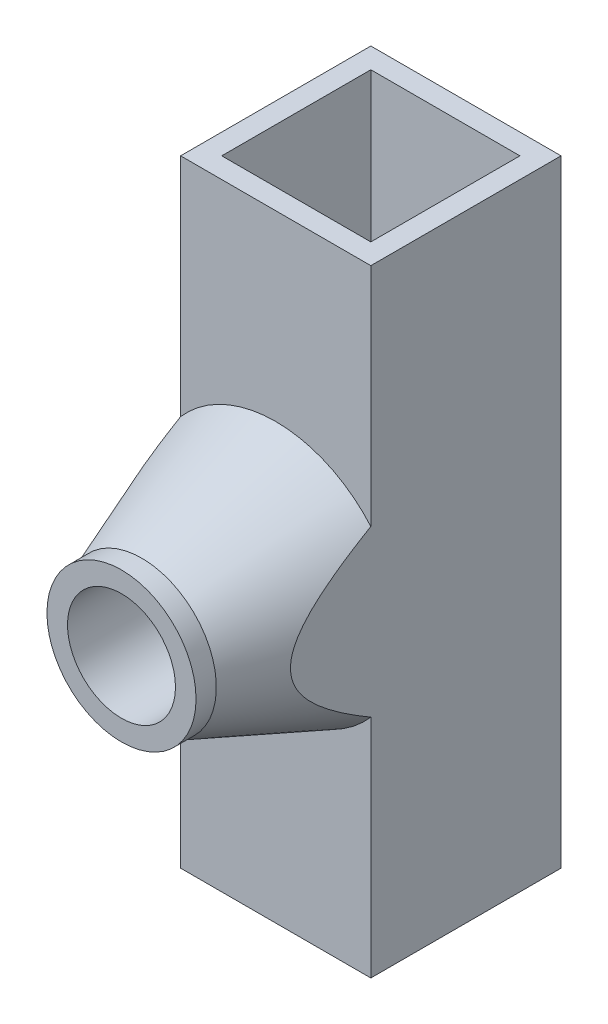
ISO-10303-21;
HEADER;
FILE_DESCRIPTION(('STEP AP214'),'2;1');
FILE_NAME('part.step','',(''),(''),'','','');
FILE_SCHEMA(('AUTOMOTIVE_DESIGN { 1 0 10303 214 1 1 1 1 }'));
ENDSEC;
DATA;
#1=APPLICATION_CONTEXT('core data for automotive mechanical design processes');
#2=APPLICATION_PROTOCOL_DEFINITION('international standard','automotive_design',2000,#1);
#3=PRODUCT_CONTEXT('',#1,'mechanical');
#4=PRODUCT('Part','Part','',(#3));
#5=PRODUCT_RELATED_PRODUCT_CATEGORY('part','',(#4));
#6=PRODUCT_DEFINITION_FORMATION('','',#4);
#7=PRODUCT_DEFINITION_CONTEXT('part definition',#1,'design');
#8=PRODUCT_DEFINITION('design','',#6,#7);
#9=PRODUCT_DEFINITION_SHAPE('','',#8);
#10=(LENGTH_UNIT() NAMED_UNIT(*) SI_UNIT(.MILLI.,.METRE.));
#11=(NAMED_UNIT(*) PLANE_ANGLE_UNIT() SI_UNIT($,.RADIAN.));
#12=(NAMED_UNIT(*) SI_UNIT($,.STERADIAN.) SOLID_ANGLE_UNIT());
#13=UNCERTAINTY_MEASURE_WITH_UNIT(LENGTH_MEASURE(1.E-05),#10,'distance_accuracy_value','');
#14=(GEOMETRIC_REPRESENTATION_CONTEXT(3) GLOBAL_UNCERTAINTY_ASSIGNED_CONTEXT((#13)) GLOBAL_UNIT_ASSIGNED_CONTEXT((#10,
#11,#12)) REPRESENTATION_CONTEXT('',''));
#15=CARTESIAN_POINT('',(0.,0.,0.));
#16=DIRECTION('',(0.,0.,1.));
#17=DIRECTION('',(1.,0.,0.));
#18=AXIS2_PLACEMENT_3D('',#15,#16,#17);
#19=CARTESIAN_POINT('',(-9.25,60.,9.25));
#20=DIRECTION('',(0.,0.,-1.));
#21=DIRECTION('',(-1.,0.,0.));
#22=AXIS2_PLACEMENT_3D('',#19,#20,#21);
#23=PLANE('',#22);
#24=DIRECTION('',(0.,-1.,0.));
#25=VECTOR('',#24,1.);
#26=CARTESIAN_POINT('',(9.25,60.,9.25));
#27=LINE('',#26,#25);
#28=CARTESIAN_POINT('',(9.25,21.9688107978954,9.25));
#29=VERTEX_POINT('',#28);
#30=CARTESIAN_POINT('',(9.25,0.,9.25));
#31=VERTEX_POINT('',#30);
#32=EDGE_CURVE('E187',#29,#31,#27,.T.);
#33=ORIENTED_EDGE('',*,*,#32,.F.);
#34=CARTESIAN_POINT('',(0.,30.,9.25));
#35=DIRECTION('',(0.,0.,-1.));
#36=DIRECTION('',(-1.,0.,0.));
#37=AXIS2_PLACEMENT_3D('',#34,#35,#36);
#38=CIRCLE('',#37,12.2500000000001);
#39=CARTESIAN_POINT('',(-9.24999999999999,21.9688107978954,9.25));
#40=VERTEX_POINT('',#39);
#41=EDGE_CURVE('E199',#29,#40,#38,.T.);
#42=ORIENTED_EDGE('',*,*,#41,.T.);
#43=DIRECTION('',(0.,-1.,0.));
#44=VECTOR('',#43,1.);
#45=CARTESIAN_POINT('',(-9.25,60.,9.25));
#46=LINE('',#45,#44);
#47=CARTESIAN_POINT('',(-9.25,0.,9.25));
#48=VERTEX_POINT('',#47);
#49=EDGE_CURVE('E191',#40,#48,#46,.T.);
#50=ORIENTED_EDGE('',*,*,#49,.T.);
#51=DIRECTION('',(1.,0.,0.));
#52=VECTOR('',#51,1.);
#53=CARTESIAN_POINT('',(-9.25,0.,9.25));
#54=LINE('',#53,#52);
#55=EDGE_CURVE('E176',#48,#31,#54,.T.);
#56=ORIENTED_EDGE('',*,*,#55,.T.);
#57=EDGE_LOOP('',(#33,#42,#50,#56));
#58=FACE_BOUND('',#57,.T.);
#59=ADVANCED_FACE('F35',(#58),#23,.F.);
#60=CARTESIAN_POINT('',(0.,60.,0.));
#61=DIRECTION('',(0.,-1.,0.));
#62=DIRECTION('',(0.,0.,-1.));
#63=AXIS2_PLACEMENT_3D('',#60,#61,#62);
#64=PLANE('',#63);
#65=DIRECTION('',(0.,0.,1.));
#66=VECTOR('',#65,1.);
#67=CARTESIAN_POINT('',(-9.25,60.,9.25));
#68=LINE('',#67,#66);
#69=CARTESIAN_POINT('',(-9.25,60.,-9.25));
#70=VERTEX_POINT('',#69);
#71=CARTESIAN_POINT('',(-9.25,60.,9.25));
#72=VERTEX_POINT('',#71);
#73=EDGE_CURVE('E163',#70,#72,#68,.T.);
#74=ORIENTED_EDGE('',*,*,#73,.T.);
#75=DIRECTION('',(1.,0.,0.));
#76=VECTOR('',#75,1.);
#77=CARTESIAN_POINT('',(-9.25,60.,9.25));
#78=LINE('',#77,#76);
#79=CARTESIAN_POINT('',(9.25,60.,9.25));
#80=VERTEX_POINT('',#79);
#81=EDGE_CURVE('E166',#72,#80,#78,.T.);
#82=ORIENTED_EDGE('',*,*,#81,.T.);
#83=DIRECTION('',(0.,0.,-1.));
#84=VECTOR('',#83,1.);
#85=CARTESIAN_POINT('',(9.25,60.,9.25));
#86=LINE('',#85,#84);
#87=CARTESIAN_POINT('',(9.25,60.,-9.25));
#88=VERTEX_POINT('',#87);
#89=EDGE_CURVE('E169',#80,#88,#86,.T.);
#90=ORIENTED_EDGE('',*,*,#89,.T.);
#91=DIRECTION('',(-1.,0.,0.));
#92=VECTOR('',#91,1.);
#93=CARTESIAN_POINT('',(-9.25,60.,-9.25));
#94=LINE('',#93,#92);
#95=EDGE_CURVE('E171',#88,#70,#94,.T.);
#96=ORIENTED_EDGE('',*,*,#95,.T.);
#97=EDGE_LOOP('',(#74,#82,#90,#96));
#98=FACE_BOUND('',#97,.T.);
#99=DIRECTION('',(0.,0.,-1.));
#100=VECTOR('',#99,1.);
#101=CARTESIAN_POINT('',(7.25,60.,7.25));
#102=LINE('',#101,#100);
#103=CARTESIAN_POINT('',(7.25,60.,7.25));
#104=VERTEX_POINT('',#103);
#105=CARTESIAN_POINT('',(7.25,60.,-7.25));
#106=VERTEX_POINT('',#105);
#107=EDGE_CURVE('E119',#104,#106,#102,.T.);
#108=ORIENTED_EDGE('',*,*,#107,.F.);
#109=DIRECTION('',(1.,0.,0.));
#110=VECTOR('',#109,1.);
#111=CARTESIAN_POINT('',(-7.25,60.,7.25));
#112=LINE('',#111,#110);
#113=CARTESIAN_POINT('',(-7.25,60.,7.25));
#114=VERTEX_POINT('',#113);
#115=EDGE_CURVE('E145',#114,#104,#112,.T.);
#116=ORIENTED_EDGE('',*,*,#115,.F.);
#117=DIRECTION('',(0.,0.,1.));
#118=VECTOR('',#117,1.);
#119=CARTESIAN_POINT('',(-7.25,60.,7.25));
#120=LINE('',#119,#118);
#121=CARTESIAN_POINT('',(-7.25,60.,-7.25));
#122=VERTEX_POINT('',#121);
#123=EDGE_CURVE('E143',#122,#114,#120,.T.);
#124=ORIENTED_EDGE('',*,*,#123,.F.);
#125=DIRECTION('',(-1.,0.,0.));
#126=VECTOR('',#125,1.);
#127=CARTESIAN_POINT('',(-7.25,60.,-7.25));
#128=LINE('',#127,#126);
#129=EDGE_CURVE('E129',#106,#122,#128,.T.);
#130=ORIENTED_EDGE('',*,*,#129,.F.);
#131=EDGE_LOOP('',(#108,#116,#124,#130));
#132=FACE_BOUND('',#131,.T.);
#133=ADVANCED_FACE('F141',(#98,#132),#64,.F.);
#134=CARTESIAN_POINT('',(0.,0.,0.));
#135=DIRECTION('',(0.,-1.,0.));
#136=DIRECTION('',(0.,0.,-1.));
#137=AXIS2_PLACEMENT_3D('',#134,#135,#136);
#138=PLANE('',#137);
#139=DIRECTION('',(0.,0.,1.));
#140=VECTOR('',#139,1.);
#141=CARTESIAN_POINT('',(-9.25,0.,9.25));
#142=LINE('',#141,#140);
#143=CARTESIAN_POINT('',(-9.25,0.,-9.25));
#144=VERTEX_POINT('',#143);
#145=EDGE_CURVE('E137',#144,#48,#142,.T.);
#146=ORIENTED_EDGE('',*,*,#145,.F.);
#147=DIRECTION('',(-1.,0.,0.));
#148=VECTOR('',#147,1.);
#149=CARTESIAN_POINT('',(-9.25,0.,-9.25));
#150=LINE('',#149,#148);
#151=CARTESIAN_POINT('',(9.25,0.,-9.25));
#152=VERTEX_POINT('',#151);
#153=EDGE_CURVE('E167',#152,#144,#150,.T.);
#154=ORIENTED_EDGE('',*,*,#153,.F.);
#155=DIRECTION('',(0.,0.,-1.));
#156=VECTOR('',#155,1.);
#157=CARTESIAN_POINT('',(9.25,0.,9.25));
#158=LINE('',#157,#156);
#159=EDGE_CURVE('E179',#31,#152,#158,.T.);
#160=ORIENTED_EDGE('',*,*,#159,.F.);
#161=ORIENTED_EDGE('',*,*,#55,.F.);
#162=EDGE_LOOP('',(#146,#154,#160,#161));
#163=FACE_BOUND('',#162,.T.);
#164=DIRECTION('',(1.,0.,0.));
#165=VECTOR('',#164,1.);
#166=CARTESIAN_POINT('',(-7.25,0.,7.25));
#167=LINE('',#166,#165);
#168=CARTESIAN_POINT('',(-7.25,0.,7.25));
#169=VERTEX_POINT('',#168);
#170=CARTESIAN_POINT('',(7.25,0.,7.25));
#171=VERTEX_POINT('',#170);
#172=EDGE_CURVE('E130',#169,#171,#167,.T.);
#173=ORIENTED_EDGE('',*,*,#172,.T.);
#174=DIRECTION('',(0.,0.,-1.));
#175=VECTOR('',#174,1.);
#176=CARTESIAN_POINT('',(7.25,0.,7.25));
#177=LINE('',#176,#175);
#178=CARTESIAN_POINT('',(7.25,0.,-7.25));
#179=VERTEX_POINT('',#178);
#180=EDGE_CURVE('E150',#171,#179,#177,.T.);
#181=ORIENTED_EDGE('',*,*,#180,.T.);
#182=DIRECTION('',(-1.,0.,0.));
#183=VECTOR('',#182,1.);
#184=CARTESIAN_POINT('',(-7.25,0.,-7.25));
#185=LINE('',#184,#183);
#186=CARTESIAN_POINT('',(-7.25,0.,-7.25));
#187=VERTEX_POINT('',#186);
#188=EDGE_CURVE('E136',#179,#187,#185,.T.);
#189=ORIENTED_EDGE('',*,*,#188,.T.);
#190=DIRECTION('',(0.,0.,1.));
#191=VECTOR('',#190,1.);
#192=CARTESIAN_POINT('',(-7.25,0.,7.25));
#193=LINE('',#192,#191);
#194=EDGE_CURVE('E154',#187,#169,#193,.T.);
#195=ORIENTED_EDGE('',*,*,#194,.T.);
#196=EDGE_LOOP('',(#173,#181,#189,#195));
#197=FACE_BOUND('',#196,.T.);
#198=ADVANCED_FACE('F209',(#163,#197),#138,.T.);
#199=CARTESIAN_POINT('',(-9.25,60.,9.25));
#200=DIRECTION('',(1.,0.,0.));
#201=DIRECTION('',(0.,0.,-1.));
#202=AXIS2_PLACEMENT_3D('',#199,#200,#201);
#203=PLANE('',#202);
#204=ORIENTED_EDGE('',*,*,#145,.T.);
#205=ORIENTED_EDGE('',*,*,#49,.F.);
#206=CARTESIAN_POINT('',(-9.24999999999999,21.9688107978954,9.25));
#207=CARTESIAN_POINT('',(-9.25,22.0998502347088,9.47377236531905));
#208=CARTESIAN_POINT('',(-9.25,22.2322280610886,9.69676945373188));
#209=CARTESIAN_POINT('',(-9.25,22.5000801055316,10.1409312038004));
#210=CARTESIAN_POINT('',(-9.25,22.6355546920192,10.3620956431145));
#211=CARTESIAN_POINT('',(-9.25,22.9105236369142,10.8031144976088));
#212=CARTESIAN_POINT('',(-9.25,23.0500316069383,11.0229604448278));
#213=CARTESIAN_POINT('',(-9.25,23.3330674366534,11.4600420813109));
#214=CARTESIAN_POINT('',(-9.25,23.4765951463395,11.6772778675473));
#215=CARTESIAN_POINT('',(-9.25,23.7791305524686,12.124645363236));
#216=CARTESIAN_POINT('',(-9.25,23.9384960388576,12.3545358930776));
#217=CARTESIAN_POINT('',(-9.25,24.2635238104705,12.8098178890145));
#218=CARTESIAN_POINT('',(-9.25,24.4291857303331,13.0352096150067));
#219=CARTESIAN_POINT('',(-9.25,24.7677449662675,13.4799576836558));
#220=CARTESIAN_POINT('',(-9.25,24.9406304655562,13.6993229798547));
#221=CARTESIAN_POINT('',(-9.25,25.295353162725,14.1306557184592));
#222=CARTESIAN_POINT('',(-9.25,25.4771882820216,14.342624859288));
#223=CARTESIAN_POINT('',(-9.25,25.8490711698124,14.7537844216926));
#224=CARTESIAN_POINT('',(-9.25,26.0389626821234,14.9531150460284));
#225=CARTESIAN_POINT('',(-9.25,26.4318525461622,15.3389561871389));
#226=CARTESIAN_POINT('',(-9.25,26.6348629981991,15.5254545310356));
#227=CARTESIAN_POINT('',(-9.25,27.0530902073979,15.8771041275751));
#228=CARTESIAN_POINT('',(-9.25,27.2680478767356,16.0425587674184));
#229=CARTESIAN_POINT('',(-9.25,27.7153570349319,16.3475041688852));
#230=CARTESIAN_POINT('',(-9.25,27.9476670746894,16.4870541918361));
#231=CARTESIAN_POINT('',(-9.25,28.3921110042399,16.7093747885392));
#232=CARTESIAN_POINT('',(-9.25,28.6013840860517,16.797688060112));
#233=CARTESIAN_POINT('',(-9.25,28.9237595636488,16.9043042800264));
#234=CARTESIAN_POINT('',(-9.25,29.0326342159228,16.9355349108723));
#235=CARTESIAN_POINT('',(-9.25,29.2526630859879,16.9884287559335));
#236=CARTESIAN_POINT('',(-9.25,29.3638161909976,17.0100965293273));
#237=CARTESIAN_POINT('',(-9.25,29.5886771350415,17.0432433557319));
#238=CARTESIAN_POINT('',(-9.25,29.7023990118196,17.0546280112001));
#239=CARTESIAN_POINT('',(-9.25,29.9304120161294,17.0664143853952));
#240=CARTESIAN_POINT('',(-9.25,30.0447031188529,17.0668165786463));
#241=CARTESIAN_POINT('',(-9.25,30.2728279387194,17.0566193968731));
#242=CARTESIAN_POINT('',(-9.25,30.3866614876192,17.0460162911388));
#243=CARTESIAN_POINT('',(-9.25,30.6128826526013,17.0142257244595));
#244=CARTESIAN_POINT('',(-9.25,30.7252694710036,16.9930326611068));
#245=CARTESIAN_POINT('',(-9.25,30.9614715209607,16.9376124680714));
#246=CARTESIAN_POINT('',(-9.25,31.0849841796039,16.9020989542531));
#247=CARTESIAN_POINT('',(-9.25,31.3283452681004,16.8200990034428));
#248=CARTESIAN_POINT('',(-9.25,31.4481910608179,16.7736048696332));
#249=CARTESIAN_POINT('',(-9.25,31.8017663898585,16.6198558987582));
#250=CARTESIAN_POINT('',(-9.25,32.0293539467454,16.4983806163139));
#251=CARTESIAN_POINT('',(-9.25,32.44370867618,16.2434569625604));
#252=CARTESIAN_POINT('',(-9.25,32.6322252155885,16.1127396183795));
#253=CARTESIAN_POINT('',(-9.25,32.9975592734626,15.8356576813769));
#254=CARTESIAN_POINT('',(-9.25,33.1743659276482,15.6892788784021));
#255=CARTESIAN_POINT('',(-9.25,33.5189926282334,15.3838892041528));
#256=CARTESIAN_POINT('',(-9.25,33.6867339902775,15.2247906291425));
#257=CARTESIAN_POINT('',(-9.25,34.0132918744874,14.8978846976661));
#258=CARTESIAN_POINT('',(-9.25,34.1721121924878,14.7300811044825));
#259=CARTESIAN_POINT('',(-9.25,34.5125744353184,14.3542650544142));
#260=CARTESIAN_POINT('',(-9.25,34.6926097742759,14.1448040039739));
#261=CARTESIAN_POINT('',(-9.25,35.0438874542972,13.7185999720595));
#262=CARTESIAN_POINT('',(-9.25,35.2151275998646,13.5018551945108));
#263=CARTESIAN_POINT('',(-9.25,35.550502953978,13.0624304091435));
#264=CARTESIAN_POINT('',(-9.25,35.7146267867817,12.8397417557639));
#265=CARTESIAN_POINT('',(-9.25,36.0366664774369,12.3899162124221));
#266=CARTESIAN_POINT('',(-9.25,36.1945819637713,12.1627790574693));
#267=CARTESIAN_POINT('',(-9.25,36.4983165251387,11.7149640489289));
#268=CARTESIAN_POINT('',(-9.25,36.6443624023799,11.4944395608964));
#269=CARTESIAN_POINT('',(-9.25,36.9322795510408,11.0506735517005));
#270=CARTESIAN_POINT('',(-9.25,37.0741506419109,10.8274319136152));
#271=CARTESIAN_POINT('',(-9.25,37.3537027949911,10.3795646612909));
#272=CARTESIAN_POINT('',(-9.25,37.4913981419048,10.1549479432901));
#273=CARTESIAN_POINT('',(-9.25,37.7635851828794,9.70382036068201));
#274=CARTESIAN_POINT('',(-9.25,37.8980772934758,9.47730974758176));
#275=CARTESIAN_POINT('',(-9.25,38.0311892021047,9.25000000000004));
#276=B_SPLINE_CURVE_WITH_KNOTS('',3,(#206,#207,#208,#209,#210,#211,#212,#213,#214,#215,#216,
#217,#218,#219,#220,#221,#222,#223,#224,#225,#226,#227,#228,#229,#230,#231,#232,#233,#234,#235,
#236,#237,#238,#239,#240,#241,#242,#243,#244,#245,#246,#247,#248,#249,#250,#251,#252,#253,#254,
#255,#256,#257,#258,#259,#260,#261,#262,#263,#264,#265,#266,#267,#268,#269,#270,#271,#272,#273,
#274,#275),.UNSPECIFIED.,.F.,.F.,(4,2,2,2,2,2,2,2,2,2,2,2,2,2,2,2,2,2,2,2,2,2,2,2,2,2,2,2,2,2,2,
2,2,2,4),(0.,0.777957788967081,1.55600861901822,2.33709255410999,3.11814738018199,
3.95723855713903,4.79628111850582,5.63400109662313,6.47152742083613,7.29697539302101,
8.12319589845028,8.93567840396673,9.74627866924139,10.4250832285197,10.764516623085,
11.1037880144456,11.4461431168985,11.7884834270352,12.130939825759,12.4735775863752,
12.8585275452384,13.2437481381477,14.014739517724,14.7020399312754,15.3899693299932,
16.0831372305757,16.7760079239939,17.6043005687233,18.4327989806615,19.2625763221648,
20.0924032434948,20.8858507948706,21.6793326106915,22.4696937006379,23.2599514478745),.UNSPECIFIED.);
#277=CARTESIAN_POINT('',(-9.24999999999999,38.0311892021046,9.25));
#278=VERTEX_POINT('',#277);
#279=EDGE_CURVE('E50',#40,#278,#276,.T.);
#280=ORIENTED_EDGE('',*,*,#279,.T.);
#281=EDGE_CURVE('E192',#72,#278,#46,.T.);
#282=ORIENTED_EDGE('',*,*,#281,.F.);
#283=ORIENTED_EDGE('',*,*,#73,.F.);
#284=DIRECTION('',(0.,-1.,0.));
#285=VECTOR('',#284,1.);
#286=CARTESIAN_POINT('',(-9.25,60.,-9.25));
#287=LINE('',#286,#285);
#288=EDGE_CURVE('E173',#70,#144,#287,.T.);
#289=ORIENTED_EDGE('',*,*,#288,.T.);
#290=EDGE_LOOP('',(#204,#205,#280,#282,#283,#289));
#291=FACE_BOUND('',#290,.T.);
#292=ADVANCED_FACE('F204',(#291),#203,.F.);
#293=ORIENTED_EDGE('',*,*,#281,.T.);
#294=CARTESIAN_POINT('',(0.,30.,9.25));
#295=DIRECTION('',(0.,0.,-1.));
#296=DIRECTION('',(-1.,0.,0.));
#297=AXIS2_PLACEMENT_3D('',#294,#295,#296);
#298=CIRCLE('',#297,12.2500000000001);
#299=CARTESIAN_POINT('',(9.25,38.0311892021046,9.25));
#300=VERTEX_POINT('',#299);
#301=EDGE_CURVE('E197',#278,#300,#298,.T.);
#302=ORIENTED_EDGE('',*,*,#301,.T.);
#303=EDGE_CURVE('E188',#80,#300,#27,.T.);
#304=ORIENTED_EDGE('',*,*,#303,.F.);
#305=ORIENTED_EDGE('',*,*,#81,.F.);
#306=EDGE_LOOP('',(#293,#302,#304,#305));
#307=FACE_BOUND('',#306,.T.);
#308=ADVANCED_FACE('F208',(#307),#23,.F.);
#309=CARTESIAN_POINT('',(9.25,60.,9.25));
#310=DIRECTION('',(-1.,0.,0.));
#311=DIRECTION('',(0.,0.,1.));
#312=AXIS2_PLACEMENT_3D('',#309,#310,#311);
#313=PLANE('',#312);
#314=ORIENTED_EDGE('',*,*,#159,.T.);
#315=DIRECTION('',(0.,-1.,0.));
#316=VECTOR('',#315,1.);
#317=CARTESIAN_POINT('',(9.25,60.,-9.25));
#318=LINE('',#317,#316);
#319=EDGE_CURVE('E184',#88,#152,#318,.T.);
#320=ORIENTED_EDGE('',*,*,#319,.F.);
#321=ORIENTED_EDGE('',*,*,#89,.F.);
#322=ORIENTED_EDGE('',*,*,#303,.T.);
#323=CARTESIAN_POINT('',(9.25,38.0311892021046,9.25));
#324=CARTESIAN_POINT('',(9.25,37.9001497652912,9.47377236531905));
#325=CARTESIAN_POINT('',(9.25,37.7677719389114,9.69676945373189));
#326=CARTESIAN_POINT('',(9.25,37.4999198944684,10.1409312038004));
#327=CARTESIAN_POINT('',(9.25,37.3644453079808,10.3620956431145));
#328=CARTESIAN_POINT('',(9.25,37.0894763630858,10.8031144976088));
#329=CARTESIAN_POINT('',(9.25,36.9499683930617,11.0229604448278));
#330=CARTESIAN_POINT('',(9.25,36.6669325633466,11.4600420813109));
#331=CARTESIAN_POINT('',(9.25,36.5234048536606,11.6772778675473));
#332=CARTESIAN_POINT('',(9.25,36.2208694475314,12.124645363236));
#333=CARTESIAN_POINT('',(9.25,36.0615039611424,12.3545358930776));
#334=CARTESIAN_POINT('',(9.25,35.7364761895295,12.8098178890145));
#335=CARTESIAN_POINT('',(9.25,35.5708142696669,13.0352096150067));
#336=CARTESIAN_POINT('',(9.25,35.2322550337325,13.4799576836558));
#337=CARTESIAN_POINT('',(9.25,35.0593695344438,13.6993229798547));
#338=CARTESIAN_POINT('',(9.25,34.704646837275,14.1306557184592));
#339=CARTESIAN_POINT('',(9.25,34.5228117179784,14.342624859288));
#340=CARTESIAN_POINT('',(9.25,34.1509288301876,14.7537844216926));
#341=CARTESIAN_POINT('',(9.25,33.9610373178766,14.9531150460284));
#342=CARTESIAN_POINT('',(9.25,33.5681474538378,15.3389561871389));
#343=CARTESIAN_POINT('',(9.25,33.3651370018009,15.5254545310356));
#344=CARTESIAN_POINT('',(9.25,32.9469097926021,15.8771041275751));
#345=CARTESIAN_POINT('',(9.25,32.7319521232645,16.0425587674183));
#346=CARTESIAN_POINT('',(9.25,32.2846429650681,16.3475041688851));
#347=CARTESIAN_POINT('',(9.25,32.0523329253106,16.4870541918361));
#348=CARTESIAN_POINT('',(9.25,31.6078889957601,16.7093747885392));
#349=CARTESIAN_POINT('',(9.25,31.3986159139483,16.797688060112));
#350=CARTESIAN_POINT('',(9.25,31.0762404363512,16.9043042800264));
#351=CARTESIAN_POINT('',(9.25,30.9673657840772,16.9355349108723));
#352=CARTESIAN_POINT('',(9.25,30.7473369140122,16.9884287559335));
#353=CARTESIAN_POINT('',(9.25,30.6361838090024,17.0100965293273));
#354=CARTESIAN_POINT('',(9.25,30.4113228649585,17.0432433557319));
#355=CARTESIAN_POINT('',(9.25,30.2976009881805,17.0546280112001));
#356=CARTESIAN_POINT('',(9.25,30.0695879838707,17.0664143853952));
#357=CARTESIAN_POINT('',(9.25,29.9552968811472,17.0668165786463));
#358=CARTESIAN_POINT('',(9.25,29.7271720612806,17.0566193968731));
#359=CARTESIAN_POINT('',(9.25,29.6133385123808,17.0460162911388));
#360=CARTESIAN_POINT('',(9.25,29.3871173473988,17.0142257244595));
#361=CARTESIAN_POINT('',(9.25,29.2747305289964,16.9930326611068));
#362=CARTESIAN_POINT('',(9.25,29.0385284790394,16.9376124680714));
#363=CARTESIAN_POINT('',(9.25,28.9150158203961,16.9020989542531));
#364=CARTESIAN_POINT('',(9.25,28.6716547318996,16.8200990034428));
#365=CARTESIAN_POINT('',(9.25,28.5518089391821,16.7736048696332));
#366=CARTESIAN_POINT('',(9.25,28.1982336101415,16.6198558987582));
#367=CARTESIAN_POINT('',(9.25,27.9706460532546,16.4983806163139));
#368=CARTESIAN_POINT('',(9.25,27.55629132382,16.2434569625604));
#369=CARTESIAN_POINT('',(9.25,27.3677747844116,16.1127396183795));
#370=CARTESIAN_POINT('',(9.25,27.0024407265375,15.835657681377));
#371=CARTESIAN_POINT('',(9.25,26.8256340723519,15.6892788784022));
#372=CARTESIAN_POINT('',(9.25,26.4810073717667,15.3838892041528));
#373=CARTESIAN_POINT('',(9.25,26.3132660097226,15.2247906291425));
#374=CARTESIAN_POINT('',(9.25,25.9867081255127,14.8978846976662));
#375=CARTESIAN_POINT('',(9.25,25.8278878075123,14.7300811044826));
#376=CARTESIAN_POINT('',(9.25,25.4874255646817,14.3542650544143));
#377=CARTESIAN_POINT('',(9.25,25.3073902257242,14.144804003974));
#378=CARTESIAN_POINT('',(9.25,24.9561125457028,13.7185999720596));
#379=CARTESIAN_POINT('',(9.25,24.7848724001354,13.5018551945108));
#380=CARTESIAN_POINT('',(9.25,24.449497046022,13.0624304091436));
#381=CARTESIAN_POINT('',(9.25,24.2853732132184,12.839741755764));
#382=CARTESIAN_POINT('',(9.25,23.9633335225631,12.3899162124221));
#383=CARTESIAN_POINT('',(9.25,23.8054180362287,12.1627790574693));
#384=CARTESIAN_POINT('',(9.25,23.5016834748613,11.714964048929));
#385=CARTESIAN_POINT('',(9.25,23.3556375976201,11.4944395608965));
#386=CARTESIAN_POINT('',(9.25,23.0677204489592,11.0506735517005));
#387=CARTESIAN_POINT('',(9.25,22.9258493580892,10.8274319136152));
#388=CARTESIAN_POINT('',(9.25,22.646297205009,10.3795646612909));
#389=CARTESIAN_POINT('',(9.25,22.5086018580952,10.1549479432901));
#390=CARTESIAN_POINT('',(9.25,22.2364148171206,9.70382036068203));
#391=CARTESIAN_POINT('',(9.25,22.1019227065242,9.47730974758177));
#392=CARTESIAN_POINT('',(9.25,21.9688107978953,9.25000000000004));
#393=B_SPLINE_CURVE_WITH_KNOTS('',3,(#323,#324,#325,#326,#327,#328,#329,#330,#331,#332,#333,
#334,#335,#336,#337,#338,#339,#340,#341,#342,#343,#344,#345,#346,#347,#348,#349,#350,#351,#352,
#353,#354,#355,#356,#357,#358,#359,#360,#361,#362,#363,#364,#365,#366,#367,#368,#369,#370,#371,
#372,#373,#374,#375,#376,#377,#378,#379,#380,#381,#382,#383,#384,#385,#386,#387,#388,#389,#390,
#391,#392),.UNSPECIFIED.,.F.,.F.,(4,2,2,2,2,2,2,2,2,2,2,2,2,2,2,2,2,2,2,2,2,2,2,2,2,2,2,2,2,2,2,
2,2,2,4),(0.,0.777957788967082,1.55600861901822,2.33709255410999,3.11814738018198,
3.95723855713902,4.7962811185058,5.63400109662311,6.4715274208361,7.29697539302097,
8.12319589845023,8.93567840396667,9.74627866924134,10.4250832285196,10.764516623085,
11.1037880144455,11.4461431168984,11.7884834270352,12.130939825759,12.4735775863752,
12.8585275452384,13.2437481381476,14.0147395177239,14.7020399312753,15.3899693299931,
16.0831372305755,16.7760079239938,17.6043005687232,18.4327989806613,19.2625763221646,
20.0924032434947,20.8858507948706,21.6793326106914,22.4696937006379,23.2599514478744),.UNSPECIFIED.);
#394=EDGE_CURVE('E11',#300,#29,#393,.T.);
#395=ORIENTED_EDGE('',*,*,#394,.T.);
#396=ORIENTED_EDGE('',*,*,#32,.T.);
#397=EDGE_LOOP('',(#314,#320,#321,#322,#395,#396));
#398=FACE_BOUND('',#397,.T.);
#399=ADVANCED_FACE('F211',(#398),#313,.F.);
#400=CARTESIAN_POINT('',(-9.25,60.,-9.25));
#401=DIRECTION('',(0.,0.,1.));
#402=DIRECTION('',(1.,0.,0.));
#403=AXIS2_PLACEMENT_3D('',#400,#401,#402);
#404=PLANE('',#403);
#405=ORIENTED_EDGE('',*,*,#153,.T.);
#406=ORIENTED_EDGE('',*,*,#288,.F.);
#407=ORIENTED_EDGE('',*,*,#95,.F.);
#408=ORIENTED_EDGE('',*,*,#319,.T.);
#409=EDGE_LOOP('',(#405,#406,#407,#408));
#410=FACE_BOUND('',#409,.T.);
#411=ADVANCED_FACE('F217',(#410),#404,.F.);
#412=CARTESIAN_POINT('',(7.25,60.,7.25));
#413=DIRECTION('',(-1.,0.,0.));
#414=DIRECTION('',(0.,0.,1.));
#415=AXIS2_PLACEMENT_3D('',#412,#413,#414);
#416=PLANE('',#415);
#417=ORIENTED_EDGE('',*,*,#180,.F.);
#418=DIRECTION('',(0.,-1.,0.));
#419=VECTOR('',#418,1.);
#420=CARTESIAN_POINT('',(7.25,60.,7.25));
#421=LINE('',#420,#419);
#422=EDGE_CURVE('E125',#104,#171,#421,.T.);
#423=ORIENTED_EDGE('',*,*,#422,.F.);
#424=ORIENTED_EDGE('',*,*,#107,.T.);
#425=DIRECTION('',(0.,-1.,0.));
#426=VECTOR('',#425,1.);
#427=CARTESIAN_POINT('',(7.25,60.,-7.25));
#428=LINE('',#427,#426);
#429=EDGE_CURVE('E122',#106,#179,#428,.T.);
#430=ORIENTED_EDGE('',*,*,#429,.T.);
#431=EDGE_LOOP('',(#417,#423,#424,#430));
#432=FACE_BOUND('',#431,.T.);
#433=ADVANCED_FACE('F121',(#432),#416,.T.);
#434=CARTESIAN_POINT('',(-7.25,60.,-7.25));
#435=DIRECTION('',(0.,0.,1.));
#436=DIRECTION('',(1.,0.,0.));
#437=AXIS2_PLACEMENT_3D('',#434,#435,#436);
#438=PLANE('',#437);
#439=ORIENTED_EDGE('',*,*,#188,.F.);
#440=ORIENTED_EDGE('',*,*,#429,.F.);
#441=ORIENTED_EDGE('',*,*,#129,.T.);
#442=DIRECTION('',(0.,-1.,0.));
#443=VECTOR('',#442,1.);
#444=CARTESIAN_POINT('',(-7.25,60.,-7.25));
#445=LINE('',#444,#443);
#446=EDGE_CURVE('E138',#122,#187,#445,.T.);
#447=ORIENTED_EDGE('',*,*,#446,.T.);
#448=EDGE_LOOP('',(#439,#440,#441,#447));
#449=FACE_BOUND('',#448,.T.);
#450=ADVANCED_FACE('F133',(#449),#438,.T.);
#451=CARTESIAN_POINT('',(-7.25,60.,7.25));
#452=DIRECTION('',(1.,0.,0.));
#453=DIRECTION('',(0.,0.,-1.));
#454=AXIS2_PLACEMENT_3D('',#451,#452,#453);
#455=PLANE('',#454);
#456=ORIENTED_EDGE('',*,*,#194,.F.);
#457=ORIENTED_EDGE('',*,*,#446,.F.);
#458=ORIENTED_EDGE('',*,*,#123,.T.);
#459=DIRECTION('',(0.,-1.,0.));
#460=VECTOR('',#459,1.);
#461=CARTESIAN_POINT('',(-7.25,60.,7.25));
#462=LINE('',#461,#460);
#463=EDGE_CURVE('E160',#114,#169,#462,.T.);
#464=ORIENTED_EDGE('',*,*,#463,.T.);
#465=EDGE_LOOP('',(#456,#457,#458,#464));
#466=FACE_BOUND('',#465,.T.);
#467=ADVANCED_FACE('F232',(#466),#455,.T.);
#468=CARTESIAN_POINT('',(-7.25,60.,7.25));
#469=DIRECTION('',(0.,0.,-1.));
#470=DIRECTION('',(-1.,0.,0.));
#471=AXIS2_PLACEMENT_3D('',#468,#469,#470);
#472=PLANE('',#471);
#473=ORIENTED_EDGE('',*,*,#172,.F.);
#474=ORIENTED_EDGE('',*,*,#463,.F.);
#475=ORIENTED_EDGE('',*,*,#115,.T.);
#476=ORIENTED_EDGE('',*,*,#422,.T.);
#477=EDGE_LOOP('',(#473,#474,#475,#476));
#478=FACE_BOUND('',#477,.T.);
#479=ADVANCED_FACE('F235',(#478),#472,.T.);
#480=CARTESIAN_POINT('',(0.,30.,24.25));
#481=DIRECTION('',(0.,0.,1.));
#482=DIRECTION('',(1.,0.,0.));
#483=AXIS2_PLACEMENT_3D('',#480,#481,#482);
#484=PLANE('',#483);
#485=CARTESIAN_POINT('',(0.,30.,24.25));
#486=DIRECTION('',(0.,0.,1.));
#487=DIRECTION('',(1.,0.,0.));
#488=AXIS2_PLACEMENT_3D('',#485,#486,#487);
#489=CIRCLE('',#488,7.25);
#490=CARTESIAN_POINT('',(7.25,30.,24.25));
#491=VERTEX_POINT('',#490);
#492=EDGE_CURVE('E152',#491,#491,#489,.T.);
#493=ORIENTED_EDGE('',*,*,#492,.T.);
#494=EDGE_LOOP('',(#493));
#495=FACE_BOUND('',#494,.T.);
#496=CARTESIAN_POINT('',(0.,30.,24.25));
#497=DIRECTION('',(0.,0.,1.));
#498=DIRECTION('',(1.,0.,0.));
#499=AXIS2_PLACEMENT_3D('',#496,#497,#498);
#500=CIRCLE('',#499,5.25);
#501=CARTESIAN_POINT('',(5.25,30.,24.25));
#502=VERTEX_POINT('',#501);
#503=EDGE_CURVE('E282',#502,#502,#500,.T.);
#504=ORIENTED_EDGE('',*,*,#503,.F.);
#505=EDGE_LOOP('',(#504));
#506=FACE_BOUND('',#505,.T.);
#507=ADVANCED_FACE('F239',(#495,#506),#484,.T.);
#508=CARTESIAN_POINT('',(0.,30.,24.25));
#509=DIRECTION('',(0.,0.,-1.));
#510=DIRECTION('',(-1.,0.,0.));
#511=AXIS2_PLACEMENT_3D('',#508,#509,#510);
#512=CYLINDRICAL_SURFACE('',#511,7.25);
#513=CARTESIAN_POINT('',(0.,30.,22.2754453234694));
#514=DIRECTION('',(0.,0.,-1.));
#515=DIRECTION('',(-1.,0.,0.));
#516=AXIS2_PLACEMENT_3D('',#513,#514,#515);
#517=CIRCLE('',#516,7.25);
#518=CARTESIAN_POINT('',(-7.25,30.,22.2754453234694));
#519=VERTEX_POINT('',#518);
#520=EDGE_CURVE('E194',#519,#519,#517,.F.);
#521=ORIENTED_EDGE('',*,*,#520,.T.);
#522=EDGE_LOOP('',(#521));
#523=FACE_BOUND('',#522,.T.);
#524=ORIENTED_EDGE('',*,*,#492,.F.);
#525=EDGE_LOOP('',(#524));
#526=FACE_BOUND('',#525,.T.);
#527=ADVANCED_FACE('F241',(#523,#526),#512,.T.);
#528=CARTESIAN_POINT('',(0.,30.,24.25));
#529=DIRECTION('',(0.,0.,-1.));
#530=DIRECTION('',(-1.,0.,0.));
#531=AXIS2_PLACEMENT_3D('',#528,#529,#530);
#532=CYLINDRICAL_SURFACE('',#531,5.25);
#533=ORIENTED_EDGE('',*,*,#503,.T.);
#534=EDGE_LOOP('',(#533));
#535=FACE_BOUND('',#534,.T.);
#536=CARTESIAN_POINT('',(0.,30.,9.25));
#537=DIRECTION('',(0.,0.,1.));
#538=DIRECTION('',(1.,0.,0.));
#539=AXIS2_PLACEMENT_3D('',#536,#537,#538);
#540=CIRCLE('',#539,5.25);
#541=CARTESIAN_POINT('',(5.25,30.,9.25));
#542=VERTEX_POINT('',#541);
#543=EDGE_CURVE('E283',#542,#542,#540,.T.);
#544=ORIENTED_EDGE('',*,*,#543,.F.);
#545=EDGE_LOOP('',(#544));
#546=FACE_BOUND('',#545,.T.);
#547=ADVANCED_FACE('F244',(#535,#546),#532,.F.);
#548=ORIENTED_EDGE('',*,*,#543,.T.);
#549=EDGE_LOOP('',(#548));
#550=FACE_BOUND('',#549,.T.);
#551=ADVANCED_FACE('F213',(#550),#23,.F.);
#552=CARTESIAN_POINT('',(0.,30.,22.2754453234694));
#553=DIRECTION('',(0.,0.,-1.));
#554=DIRECTION('',(-1.,0.,0.));
#555=AXIS2_PLACEMENT_3D('',#552,#553,#554);
#556=CONICAL_SURFACE('',#555,7.25,0.366519142918806);
#557=ORIENTED_EDGE('',*,*,#279,.F.);
#558=ORIENTED_EDGE('',*,*,#41,.F.);
#559=ORIENTED_EDGE('',*,*,#394,.F.);
#560=ORIENTED_EDGE('',*,*,#301,.F.);
#561=EDGE_LOOP('',(#557,#558,#559,#560));
#562=FACE_BOUND('',#561,.T.);
#563=ORIENTED_EDGE('',*,*,#520,.F.);
#564=EDGE_LOOP('',(#563));
#565=FACE_BOUND('',#564,.T.);
#566=ADVANCED_FACE('F38',(#562,#565),#556,.T.);
#567=CLOSED_SHELL('',(#59,#133,#198,#292,#308,#399,#411,#433,#450,#467,#479,#507,#527,#547,#551,#566));
#568=MANIFOLD_SOLID_BREP('B2',#567);
#569=ADVANCED_BREP_SHAPE_REPRESENTATION('',(#18,#568),#14);
#570=SHAPE_DEFINITION_REPRESENTATION(#9,#569);
ENDSEC;
END-ISO-10303-21;
